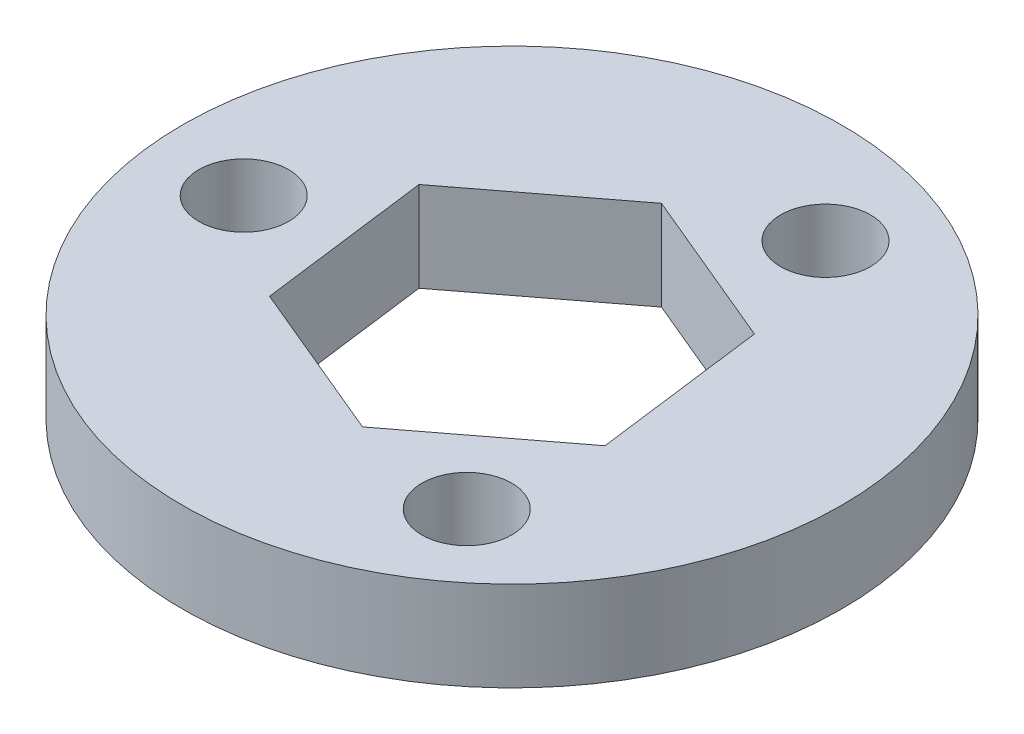
ISO-10303-21;
HEADER;
FILE_DESCRIPTION(('STEP AP214'),'2;1');
FILE_NAME('part.step','',(''),(''),'','','');
FILE_SCHEMA(('AUTOMOTIVE_DESIGN { 1 0 10303 214 1 1 1 1 }'));
ENDSEC;
DATA;
#1=APPLICATION_CONTEXT('core data for automotive mechanical design processes');
#2=APPLICATION_PROTOCOL_DEFINITION('international standard','automotive_design',2000,#1);
#3=PRODUCT_CONTEXT('',#1,'mechanical');
#4=PRODUCT('Part','Part','',(#3));
#5=PRODUCT_RELATED_PRODUCT_CATEGORY('part','',(#4));
#6=PRODUCT_DEFINITION_FORMATION('','',#4);
#7=PRODUCT_DEFINITION_CONTEXT('part definition',#1,'design');
#8=PRODUCT_DEFINITION('design','',#6,#7);
#9=PRODUCT_DEFINITION_SHAPE('','',#8);
#10=(LENGTH_UNIT() NAMED_UNIT(*) SI_UNIT(.MILLI.,.METRE.));
#11=(NAMED_UNIT(*) PLANE_ANGLE_UNIT() SI_UNIT($,.RADIAN.));
#12=(NAMED_UNIT(*) SI_UNIT($,.STERADIAN.) SOLID_ANGLE_UNIT());
#13=UNCERTAINTY_MEASURE_WITH_UNIT(LENGTH_MEASURE(1.E-05),#10,'distance_accuracy_value','');
#14=(GEOMETRIC_REPRESENTATION_CONTEXT(3) GLOBAL_UNCERTAINTY_ASSIGNED_CONTEXT((#13)) GLOBAL_UNIT_ASSIGNED_CONTEXT((#10,
#11,#12)) REPRESENTATION_CONTEXT('',''));
#15=CARTESIAN_POINT('',(0.,0.,0.));
#16=DIRECTION('',(0.,0.,1.));
#17=DIRECTION('',(1.,0.,0.));
#18=AXIS2_PLACEMENT_3D('',#15,#16,#17);
#19=CARTESIAN_POINT('',(1.03277976570358E-13,-91.,-2.69726872617106E-13));
#20=DIRECTION('',(0.,1.,0.));
#21=DIRECTION('',(0.991821591033947,0.,-0.127632016198486));
#22=AXIS2_PLACEMENT_3D('',#19,#20,#21);
#23=PLANE('',#22);
#24=CARTESIAN_POINT('',(3.08302581722296,-91.,-7.3820696156526));
#25=DIRECTION('',(0.,1.,0.));
#26=DIRECTION('',(0.991821591033947,0.,-0.127632016198486));
#27=AXIS2_PLACEMENT_3D('',#24,#25,#26);
#28=CIRCLE('',#27,1.5);
#29=CARTESIAN_POINT('',(4.57075820377388,-91.,-7.57351763995033));
#30=VERTEX_POINT('',#29);
#31=EDGE_CURVE('E274',#30,#30,#28,.T.);
#32=ORIENTED_EDGE('',*,*,#31,.F.);
#33=EDGE_LOOP('',(#32));
#34=FACE_BOUND('',#33,.T.);
#35=DIRECTION('',(0.922758701956541,0.,0.385378227152857));
#36=VECTOR('',#35,1.);
#37=CARTESIAN_POINT('',(-4.59066606062258,-91.,3.50130239384982));
#38=LINE('',#37,#36);
#39=CARTESIAN_POINT('',(-4.59066606062258,-91.,3.50130239384982));
#40=VERTEX_POINT('',#39);
#41=CARTESIAN_POINT('',(0.736883789094212,-91.,5.72628462571505));
#42=VERTEX_POINT('',#41);
#43=EDGE_CURVE('E97',#40,#42,#38,.T.);
#44=ORIENTED_EDGE('',*,*,#43,.F.);
#45=DIRECTION('',(0.127632016198486,0.,0.991821591033947));
#46=VECTOR('',#45,1.);
#47=CARTESIAN_POINT('',(-5.32754984971668,-91.,-2.2249822318655));
#48=LINE('',#47,#46);
#49=CARTESIAN_POINT('',(-5.32754984971668,-91.,-2.2249822318655));
#50=VERTEX_POINT('',#49);
#51=EDGE_CURVE('E89',#50,#40,#48,.T.);
#52=ORIENTED_EDGE('',*,*,#51,.F.);
#53=DIRECTION('',(-0.795126685758055,0.,0.60644336388109));
#54=VECTOR('',#53,1.);
#55=CARTESIAN_POINT('',(-0.736883789094007,-91.,-5.72628462571559));
#56=LINE('',#55,#54);
#57=CARTESIAN_POINT('',(-0.736883789094007,-91.,-5.72628462571559));
#58=VERTEX_POINT('',#57);
#59=EDGE_CURVE('E122',#58,#50,#56,.T.);
#60=ORIENTED_EDGE('',*,*,#59,.F.);
#61=DIRECTION('',(-0.922758701956541,0.,-0.385378227152857));
#62=VECTOR('',#61,1.);
#63=CARTESIAN_POINT('',(4.59066606062278,-91.,-3.50130239385036));
#64=LINE('',#63,#62);
#65=CARTESIAN_POINT('',(4.59066606062278,-91.,-3.50130239385036));
#66=VERTEX_POINT('',#65);
#67=EDGE_CURVE('E120',#66,#58,#64,.T.);
#68=ORIENTED_EDGE('',*,*,#67,.F.);
#69=DIRECTION('',(-0.127632016198486,0.,-0.991821591033947));
#70=VECTOR('',#69,1.);
#71=CARTESIAN_POINT('',(5.32754984971689,-91.,2.22498223186495));
#72=LINE('',#71,#70);
#73=CARTESIAN_POINT('',(5.32754984971689,-91.,2.22498223186495));
#74=VERTEX_POINT('',#73);
#75=EDGE_CURVE('E115',#74,#66,#72,.T.);
#76=ORIENTED_EDGE('',*,*,#75,.F.);
#77=DIRECTION('',(0.795126685758055,0.,-0.60644336388109));
#78=VECTOR('',#77,1.);
#79=CARTESIAN_POINT('',(0.736883789094212,-91.,5.72628462571505));
#80=LINE('',#79,#78);
#81=EDGE_CURVE('E110',#42,#74,#80,.T.);
#82=ORIENTED_EDGE('',*,*,#81,.F.);
#83=EDGE_LOOP('',(#44,#52,#60,#68,#76,#82));
#84=FACE_BOUND('',#83,.T.);
#85=CARTESIAN_POINT('',(1.03277976570358E-13,-91.,-2.69726872617106E-13));
#86=DIRECTION('',(0.,1.,0.));
#87=DIRECTION('',(0.991821591033947,0.,-0.127632016198486));
#88=AXIS2_PLACEMENT_3D('',#85,#86,#87);
#89=CIRCLE('',#88,11.);
#90=CARTESIAN_POINT('',(10.9100375013735,-91.,-1.40395217818362));
#91=VERTEX_POINT('',#90);
#92=EDGE_CURVE('E11',#91,#91,#89,.T.);
#93=ORIENTED_EDGE('',*,*,#92,.T.);
#94=EDGE_LOOP('',(#93));
#95=FACE_BOUND('',#94,.T.);
#96=CARTESIAN_POINT('',(-7.93457272827147,-91.,1.02105612958762));
#97=DIRECTION('',(0.,1.,0.));
#98=DIRECTION('',(0.991821591033947,0.,-0.127632016198486));
#99=AXIS2_PLACEMENT_3D('',#96,#97,#98);
#100=CIRCLE('',#99,1.5);
#101=CARTESIAN_POINT('',(-6.44684034172055,-91.,0.829608105289891));
#102=VERTEX_POINT('',#101);
#103=EDGE_CURVE('E125',#102,#102,#100,.T.);
#104=ORIENTED_EDGE('',*,*,#103,.F.);
#105=EDGE_LOOP('',(#104));
#106=FACE_BOUND('',#105,.T.);
#107=CARTESIAN_POINT('',(4.85154691104882,-91.,6.36101348606417));
#108=DIRECTION('',(0.,1.,0.));
#109=DIRECTION('',(0.991821591033947,0.,-0.127632016198486));
#110=AXIS2_PLACEMENT_3D('',#107,#108,#109);
#111=CIRCLE('',#110,1.5);
#112=CARTESIAN_POINT('',(6.33927929759974,-91.,6.16956546176644));
#113=VERTEX_POINT('',#112);
#114=EDGE_CURVE('E281',#113,#113,#111,.T.);
#115=ORIENTED_EDGE('',*,*,#114,.F.);
#116=EDGE_LOOP('',(#115));
#117=FACE_BOUND('',#116,.T.);
#118=ADVANCED_FACE('F36',(#34,#84,#95,#106,#117),#23,.T.);
#119=CARTESIAN_POINT('',(1.00581535098195E-13,-94.,-2.66503618032686E-13));
#120=DIRECTION('',(0.,1.,0.));
#121=DIRECTION('',(0.991821591033947,0.,-0.127632016198486));
#122=AXIS2_PLACEMENT_3D('',#119,#120,#121);
#123=PLANE('',#122);
#124=CARTESIAN_POINT('',(1.00581535098195E-13,-94.,-2.66503618032686E-13));
#125=DIRECTION('',(0.,1.,0.));
#126=DIRECTION('',(0.991821591033947,0.,-0.127632016198486));
#127=AXIS2_PLACEMENT_3D('',#124,#125,#126);
#128=CIRCLE('',#127,11.);
#129=CARTESIAN_POINT('',(10.9100375013735,-94.,-1.40395217818362));
#130=VERTEX_POINT('',#129);
#131=EDGE_CURVE('E40',#130,#130,#128,.T.);
#132=ORIENTED_EDGE('',*,*,#131,.F.);
#133=EDGE_LOOP('',(#132));
#134=FACE_BOUND('',#133,.T.);
#135=DIRECTION('',(0.127632016198486,0.,0.991821591033947));
#136=VECTOR('',#135,1.);
#137=CARTESIAN_POINT('',(-5.32754984971669,-94.,-2.22498223186549));
#138=LINE('',#137,#136);
#139=CARTESIAN_POINT('',(-5.32754984971669,-94.,-2.2249822318655));
#140=VERTEX_POINT('',#139);
#141=CARTESIAN_POINT('',(-4.59066606062258,-94.,3.50130239384983));
#142=VERTEX_POINT('',#141);
#143=EDGE_CURVE('E59',#140,#142,#138,.T.);
#144=ORIENTED_EDGE('',*,*,#143,.T.);
#145=DIRECTION('',(0.922758701956541,0.,0.385378227152857));
#146=VECTOR('',#145,1.);
#147=CARTESIAN_POINT('',(-4.59066606062258,-94.,3.50130239384983));
#148=LINE('',#147,#146);
#149=CARTESIAN_POINT('',(0.73688378909421,-94.,5.72628462571505));
#150=VERTEX_POINT('',#149);
#151=EDGE_CURVE('E104',#142,#150,#148,.T.);
#152=ORIENTED_EDGE('',*,*,#151,.T.);
#153=DIRECTION('',(0.795126685758055,0.,-0.60644336388109));
#154=VECTOR('',#153,1.);
#155=CARTESIAN_POINT('',(0.73688378909421,-94.,5.72628462571505));
#156=LINE('',#155,#154);
#157=CARTESIAN_POINT('',(5.32754984971689,-94.,2.22498223186496));
#158=VERTEX_POINT('',#157);
#159=EDGE_CURVE('E127',#150,#158,#156,.T.);
#160=ORIENTED_EDGE('',*,*,#159,.T.);
#161=DIRECTION('',(-0.127632016198486,0.,-0.991821591033947));
#162=VECTOR('',#161,1.);
#163=CARTESIAN_POINT('',(5.32754984971689,-94.,2.22498223186496));
#164=LINE('',#163,#162);
#165=CARTESIAN_POINT('',(4.59066606062278,-94.,-3.50130239385036));
#166=VERTEX_POINT('',#165);
#167=EDGE_CURVE('E130',#158,#166,#164,.T.);
#168=ORIENTED_EDGE('',*,*,#167,.T.);
#169=DIRECTION('',(-0.922758701956541,0.,-0.385378227152857));
#170=VECTOR('',#169,1.);
#171=CARTESIAN_POINT('',(4.59066606062278,-94.,-3.50130239385036));
#172=LINE('',#171,#170);
#173=CARTESIAN_POINT('',(-0.73688378909401,-94.,-5.72628462571559));
#174=VERTEX_POINT('',#173);
#175=EDGE_CURVE('E133',#166,#174,#172,.T.);
#176=ORIENTED_EDGE('',*,*,#175,.T.);
#177=DIRECTION('',(-0.795126685758055,0.,0.60644336388109));
#178=VECTOR('',#177,1.);
#179=CARTESIAN_POINT('',(-0.73688378909401,-94.,-5.72628462571559));
#180=LINE('',#179,#178);
#181=EDGE_CURVE('E98',#174,#140,#180,.T.);
#182=ORIENTED_EDGE('',*,*,#181,.T.);
#183=EDGE_LOOP('',(#144,#152,#160,#168,#176,#182));
#184=FACE_BOUND('',#183,.T.);
#185=CARTESIAN_POINT('',(-7.93457272827147,-94.,1.02105612958762));
#186=DIRECTION('',(0.,1.,0.));
#187=DIRECTION('',(0.991821591033947,0.,-0.127632016198486));
#188=AXIS2_PLACEMENT_3D('',#185,#186,#187);
#189=CIRCLE('',#188,1.5);
#190=CARTESIAN_POINT('',(-6.44684034172055,-94.,0.829608105289894));
#191=VERTEX_POINT('',#190);
#192=EDGE_CURVE('E273',#191,#191,#189,.T.);
#193=ORIENTED_EDGE('',*,*,#192,.T.);
#194=EDGE_LOOP('',(#193));
#195=FACE_BOUND('',#194,.T.);
#196=CARTESIAN_POINT('',(3.08302581722296,-94.,-7.3820696156526));
#197=DIRECTION('',(0.,1.,0.));
#198=DIRECTION('',(0.991821591033947,0.,-0.127632016198486));
#199=AXIS2_PLACEMENT_3D('',#196,#197,#198);
#200=CIRCLE('',#199,1.5);
#201=CARTESIAN_POINT('',(4.57075820377388,-94.,-7.57351763995033));
#202=VERTEX_POINT('',#201);
#203=EDGE_CURVE('E277',#202,#202,#200,.T.);
#204=ORIENTED_EDGE('',*,*,#203,.T.);
#205=EDGE_LOOP('',(#204));
#206=FACE_BOUND('',#205,.T.);
#207=CARTESIAN_POINT('',(4.85154691104882,-94.,6.36101348606417));
#208=DIRECTION('',(0.,1.,0.));
#209=DIRECTION('',(0.991821591033947,0.,-0.127632016198486));
#210=AXIS2_PLACEMENT_3D('',#207,#208,#209);
#211=CIRCLE('',#210,1.5);
#212=CARTESIAN_POINT('',(6.33927929759974,-94.,6.16956546176644));
#213=VERTEX_POINT('',#212);
#214=EDGE_CURVE('E283',#213,#213,#211,.T.);
#215=ORIENTED_EDGE('',*,*,#214,.T.);
#216=EDGE_LOOP('',(#215));
#217=FACE_BOUND('',#216,.T.);
#218=ADVANCED_FACE('F151',(#134,#184,#195,#206,#217),#123,.F.);
#219=CARTESIAN_POINT('',(1.03277976570358E-13,-91.,-2.69726872617106E-13));
#220=DIRECTION('',(0.,-1.,0.));
#221=DIRECTION('',(-0.991821591033947,0.,0.127632016198486));
#222=AXIS2_PLACEMENT_3D('',#219,#220,#221);
#223=CYLINDRICAL_SURFACE('',#222,11.);
#224=ORIENTED_EDGE('',*,*,#92,.F.);
#225=EDGE_LOOP('',(#224));
#226=FACE_BOUND('',#225,.T.);
#227=ORIENTED_EDGE('',*,*,#131,.T.);
#228=EDGE_LOOP('',(#227));
#229=FACE_BOUND('',#228,.T.);
#230=ADVANCED_FACE('F38',(#226,#229),#223,.T.);
#231=CARTESIAN_POINT('',(-5.32754984971668,-91.,-2.2249822318655));
#232=DIRECTION('',(0.991821591033947,0.,-0.127632016198486));
#233=DIRECTION('',(0.127632016198486,0.,0.991821591033947));
#234=AXIS2_PLACEMENT_3D('',#231,#232,#233);
#235=PLANE('',#234);
#236=ORIENTED_EDGE('',*,*,#143,.F.);
#237=DIRECTION('',(0.,-1.,0.));
#238=VECTOR('',#237,1.);
#239=CARTESIAN_POINT('',(-5.32754984971668,-91.,-2.2249822318655));
#240=LINE('',#239,#238);
#241=EDGE_CURVE('E93',#50,#140,#240,.T.);
#242=ORIENTED_EDGE('',*,*,#241,.F.);
#243=ORIENTED_EDGE('',*,*,#51,.T.);
#244=DIRECTION('',(0.,-1.,0.));
#245=VECTOR('',#244,1.);
#246=CARTESIAN_POINT('',(-4.59066606062258,-91.,3.50130239384982));
#247=LINE('',#246,#245);
#248=EDGE_CURVE('E92',#40,#142,#247,.T.);
#249=ORIENTED_EDGE('',*,*,#248,.T.);
#250=EDGE_LOOP('',(#236,#242,#243,#249));
#251=FACE_BOUND('',#250,.T.);
#252=ADVANCED_FACE('F91',(#251),#235,.T.);
#253=CARTESIAN_POINT('',(-4.59066606062258,-91.,3.50130239384982));
#254=DIRECTION('',(0.385378227152857,0.,-0.922758701956541));
#255=DIRECTION('',(0.922758701956541,0.,0.385378227152857));
#256=AXIS2_PLACEMENT_3D('',#253,#254,#255);
#257=PLANE('',#256);
#258=ORIENTED_EDGE('',*,*,#151,.F.);
#259=ORIENTED_EDGE('',*,*,#248,.F.);
#260=ORIENTED_EDGE('',*,*,#43,.T.);
#261=DIRECTION('',(0.,-1.,0.));
#262=VECTOR('',#261,1.);
#263=CARTESIAN_POINT('',(0.736883789094212,-91.,5.72628462571505));
#264=LINE('',#263,#262);
#265=EDGE_CURVE('E105',#42,#150,#264,.T.);
#266=ORIENTED_EDGE('',*,*,#265,.T.);
#267=EDGE_LOOP('',(#258,#259,#260,#266));
#268=FACE_BOUND('',#267,.T.);
#269=ADVANCED_FACE('F101',(#268),#257,.T.);
#270=CARTESIAN_POINT('',(0.736883789094212,-91.,5.72628462571505));
#271=DIRECTION('',(-0.60644336388109,0.,-0.795126685758054));
#272=DIRECTION('',(0.795126685758055,0.,-0.60644336388109));
#273=AXIS2_PLACEMENT_3D('',#270,#271,#272);
#274=PLANE('',#273);
#275=ORIENTED_EDGE('',*,*,#159,.F.);
#276=ORIENTED_EDGE('',*,*,#265,.F.);
#277=ORIENTED_EDGE('',*,*,#81,.T.);
#278=DIRECTION('',(0.,-1.,0.));
#279=VECTOR('',#278,1.);
#280=CARTESIAN_POINT('',(5.32754984971689,-91.,2.22498223186495));
#281=LINE('',#280,#279);
#282=EDGE_CURVE('E143',#74,#158,#281,.T.);
#283=ORIENTED_EDGE('',*,*,#282,.T.);
#284=EDGE_LOOP('',(#275,#276,#277,#283));
#285=FACE_BOUND('',#284,.T.);
#286=ADVANCED_FACE('F147',(#285),#274,.T.);
#287=CARTESIAN_POINT('',(5.32754984971689,-91.,2.22498223186495));
#288=DIRECTION('',(-0.991821591033947,0.,0.127632016198486));
#289=DIRECTION('',(-0.127632016198486,0.,-0.991821591033947));
#290=AXIS2_PLACEMENT_3D('',#287,#288,#289);
#291=PLANE('',#290);
#292=ORIENTED_EDGE('',*,*,#167,.F.);
#293=ORIENTED_EDGE('',*,*,#282,.F.);
#294=ORIENTED_EDGE('',*,*,#75,.T.);
#295=DIRECTION('',(0.,-1.,0.));
#296=VECTOR('',#295,1.);
#297=CARTESIAN_POINT('',(4.59066606062278,-91.,-3.50130239385036));
#298=LINE('',#297,#296);
#299=EDGE_CURVE('E141',#66,#166,#298,.T.);
#300=ORIENTED_EDGE('',*,*,#299,.T.);
#301=EDGE_LOOP('',(#292,#293,#294,#300));
#302=FACE_BOUND('',#301,.T.);
#303=ADVANCED_FACE('F160',(#302),#291,.T.);
#304=CARTESIAN_POINT('',(4.59066606062278,-91.,-3.50130239385036));
#305=DIRECTION('',(-0.385378227152857,0.,0.922758701956541));
#306=DIRECTION('',(-0.922758701956542,0.,-0.385378227152857));
#307=AXIS2_PLACEMENT_3D('',#304,#305,#306);
#308=PLANE('',#307);
#309=ORIENTED_EDGE('',*,*,#175,.F.);
#310=ORIENTED_EDGE('',*,*,#299,.F.);
#311=ORIENTED_EDGE('',*,*,#67,.T.);
#312=DIRECTION('',(0.,-1.,0.));
#313=VECTOR('',#312,1.);
#314=CARTESIAN_POINT('',(-0.736883789094007,-91.,-5.72628462571559));
#315=LINE('',#314,#313);
#316=EDGE_CURVE('E51',#58,#174,#315,.T.);
#317=ORIENTED_EDGE('',*,*,#316,.T.);
#318=EDGE_LOOP('',(#309,#310,#311,#317));
#319=FACE_BOUND('',#318,.T.);
#320=ADVANCED_FACE('F158',(#319),#308,.T.);
#321=CARTESIAN_POINT('',(-0.736883789094007,-91.,-5.72628462571559));
#322=DIRECTION('',(0.60644336388109,0.,0.795126685758055));
#323=DIRECTION('',(-0.795126685758055,0.,0.60644336388109));
#324=AXIS2_PLACEMENT_3D('',#321,#322,#323);
#325=PLANE('',#324);
#326=ORIENTED_EDGE('',*,*,#181,.F.);
#327=ORIENTED_EDGE('',*,*,#316,.F.);
#328=ORIENTED_EDGE('',*,*,#59,.T.);
#329=ORIENTED_EDGE('',*,*,#241,.T.);
#330=EDGE_LOOP('',(#326,#327,#328,#329));
#331=FACE_BOUND('',#330,.T.);
#332=ADVANCED_FACE('F154',(#331),#325,.T.);
#333=CARTESIAN_POINT('',(-7.93457272827147,-91.,1.02105612958762));
#334=DIRECTION('',(0.,-1.,0.));
#335=DIRECTION('',(-0.991821591033947,0.,0.127632016198486));
#336=AXIS2_PLACEMENT_3D('',#333,#334,#335);
#337=CYLINDRICAL_SURFACE('',#336,1.5);
#338=ORIENTED_EDGE('',*,*,#103,.T.);
#339=EDGE_LOOP('',(#338));
#340=FACE_BOUND('',#339,.T.);
#341=ORIENTED_EDGE('',*,*,#192,.F.);
#342=EDGE_LOOP('',(#341));
#343=FACE_BOUND('',#342,.T.);
#344=ADVANCED_FACE('F242',(#340,#343),#337,.F.);
#345=CARTESIAN_POINT('',(3.08302581722296,-91.,-7.3820696156526));
#346=DIRECTION('',(0.,-1.,0.));
#347=DIRECTION('',(-0.991821591033947,0.,0.127632016198486));
#348=AXIS2_PLACEMENT_3D('',#345,#346,#347);
#349=CYLINDRICAL_SURFACE('',#348,1.5);
#350=ORIENTED_EDGE('',*,*,#31,.T.);
#351=EDGE_LOOP('',(#350));
#352=FACE_BOUND('',#351,.T.);
#353=ORIENTED_EDGE('',*,*,#203,.F.);
#354=EDGE_LOOP('',(#353));
#355=FACE_BOUND('',#354,.T.);
#356=ADVANCED_FACE('F232',(#352,#355),#349,.F.);
#357=CARTESIAN_POINT('',(4.85154691104882,-91.,6.36101348606417));
#358=DIRECTION('',(0.,-1.,0.));
#359=DIRECTION('',(-0.991821591033947,0.,0.127632016198486));
#360=AXIS2_PLACEMENT_3D('',#357,#358,#359);
#361=CYLINDRICAL_SURFACE('',#360,1.5);
#362=ORIENTED_EDGE('',*,*,#114,.T.);
#363=EDGE_LOOP('',(#362));
#364=FACE_BOUND('',#363,.T.);
#365=ORIENTED_EDGE('',*,*,#214,.F.);
#366=EDGE_LOOP('',(#365));
#367=FACE_BOUND('',#366,.T.);
#368=ADVANCED_FACE('F227',(#364,#367),#361,.F.);
#369=CLOSED_SHELL('',(#118,#218,#230,#252,#269,#286,#303,#320,#332,#344,#356,#368));
#370=MANIFOLD_SOLID_BREP('B2',#369);
#371=ADVANCED_BREP_SHAPE_REPRESENTATION('',(#18,#370),#14);
#372=SHAPE_DEFINITION_REPRESENTATION(#9,#371);
ENDSEC;
END-ISO-10303-21;
